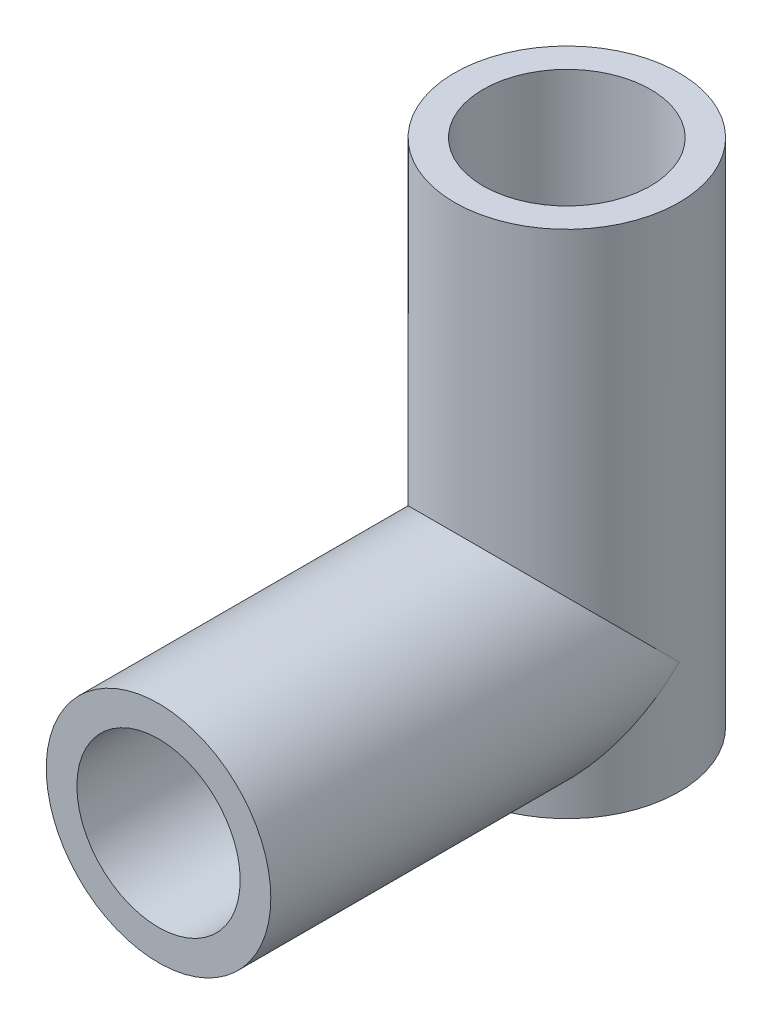
ISO-10303-21;
HEADER;
FILE_DESCRIPTION(('STEP AP214'),'2;1');
FILE_NAME('part.step','',(''),(''),'','','');
FILE_SCHEMA(('AUTOMOTIVE_DESIGN { 1 0 10303 214 1 1 1 1 }'));
ENDSEC;
DATA;
#1=APPLICATION_CONTEXT('core data for automotive mechanical design processes');
#2=APPLICATION_PROTOCOL_DEFINITION('international standard','automotive_design',2000,#1);
#3=PRODUCT_CONTEXT('',#1,'mechanical');
#4=PRODUCT('Part','Part','',(#3));
#5=PRODUCT_RELATED_PRODUCT_CATEGORY('part','',(#4));
#6=PRODUCT_DEFINITION_FORMATION('','',#4);
#7=PRODUCT_DEFINITION_CONTEXT('part definition',#1,'design');
#8=PRODUCT_DEFINITION('design','',#6,#7);
#9=PRODUCT_DEFINITION_SHAPE('','',#8);
#10=(LENGTH_UNIT() NAMED_UNIT(*) SI_UNIT(.MILLI.,.METRE.));
#11=(NAMED_UNIT(*) PLANE_ANGLE_UNIT() SI_UNIT($,.RADIAN.));
#12=(NAMED_UNIT(*) SI_UNIT($,.STERADIAN.) SOLID_ANGLE_UNIT());
#13=UNCERTAINTY_MEASURE_WITH_UNIT(LENGTH_MEASURE(1.E-05),#10,'distance_accuracy_value','');
#14=(GEOMETRIC_REPRESENTATION_CONTEXT(3) GLOBAL_UNCERTAINTY_ASSIGNED_CONTEXT((#13)) GLOBAL_UNIT_ASSIGNED_CONTEXT((#10,
#11,#12)) REPRESENTATION_CONTEXT('',''));
#15=CARTESIAN_POINT('',(0.,0.,0.));
#16=DIRECTION('',(0.,0.,1.));
#17=DIRECTION('',(1.,0.,0.));
#18=AXIS2_PLACEMENT_3D('',#15,#16,#17);
#19=CARTESIAN_POINT('',(0.,25.,0.));
#20=DIRECTION('',(0.,-1.,0.));
#21=DIRECTION('',(0.,0.,-1.));
#22=AXIS2_PLACEMENT_3D('',#19,#20,#21);
#23=CYLINDRICAL_SURFACE('',#22,5.5);
#24=CARTESIAN_POINT('',(0.,25.,0.));
#25=DIRECTION('',(0.,1.,0.));
#26=DIRECTION('',(0.,0.,1.));
#27=AXIS2_PLACEMENT_3D('',#24,#25,#26);
#28=CIRCLE('',#27,5.5);
#29=CARTESIAN_POINT('',(0.,25.,5.5));
#30=VERTEX_POINT('',#29);
#31=EDGE_CURVE('E11',#30,#30,#28,.T.);
#32=ORIENTED_EDGE('',*,*,#31,.F.);
#33=EDGE_LOOP('',(#32));
#34=FACE_BOUND('',#33,.T.);
#35=CARTESIAN_POINT('',(0.,5.5,0.));
#36=DIRECTION('',(0.,-0.707106781186547,-0.707106781186547));
#37=DIRECTION('',(0.,-0.707106781186547,0.707106781186547));
#38=AXIS2_PLACEMENT_3D('',#35,#36,#37);
#39=ELLIPSE('',#38,7.77817459305202,5.5);
#40=CARTESIAN_POINT('',(-5.5,5.5,0.));
#41=VERTEX_POINT('',#40);
#42=CARTESIAN_POINT('',(0.,0.,5.5));
#43=VERTEX_POINT('',#42);
#44=EDGE_CURVE('E67',#41,#43,#39,.F.);
#45=ORIENTED_EDGE('',*,*,#44,.F.);
#46=CARTESIAN_POINT('',(0.,5.5,0.));
#47=DIRECTION('',(0.,-0.707106781186547,0.707106781186547));
#48=DIRECTION('',(0.,-0.707106781186547,-0.707106781186547));
#49=AXIS2_PLACEMENT_3D('',#46,#47,#48);
#50=ELLIPSE('',#49,7.77817459305202,5.5);
#51=CARTESIAN_POINT('',(5.5,5.5,0.));
#52=VERTEX_POINT('',#51);
#53=EDGE_CURVE('E60',#52,#41,#50,.T.);
#54=ORIENTED_EDGE('',*,*,#53,.F.);
#55=EDGE_CURVE('E64',#43,#52,#39,.F.);
#56=ORIENTED_EDGE('',*,*,#55,.F.);
#57=CARTESIAN_POINT('',(0.,0.,0.));
#58=DIRECTION('',(0.,1.,0.));
#59=DIRECTION('',(0.,0.,1.));
#60=AXIS2_PLACEMENT_3D('',#57,#58,#59);
#61=CIRCLE('',#60,5.5);
#62=EDGE_CURVE('E52',#43,#43,#61,.T.);
#63=ORIENTED_EDGE('',*,*,#62,.T.);
#64=EDGE_LOOP('',(#45,#54,#56,#63));
#65=FACE_BOUND('',#64,.T.);
#66=ADVANCED_FACE('F39',(#34,#65),#23,.T.);
#67=CARTESIAN_POINT('',(0.,25.,0.));
#68=DIRECTION('',(0.,1.,0.));
#69=DIRECTION('',(0.,0.,1.));
#70=AXIS2_PLACEMENT_3D('',#67,#68,#69);
#71=PLANE('',#70);
#72=ORIENTED_EDGE('',*,*,#31,.T.);
#73=EDGE_LOOP('',(#72));
#74=FACE_BOUND('',#73,.T.);
#75=CARTESIAN_POINT('',(0.,25.,0.));
#76=DIRECTION('',(0.,1.,0.));
#77=DIRECTION('',(0.,0.,1.));
#78=AXIS2_PLACEMENT_3D('',#75,#76,#77);
#79=CIRCLE('',#78,4.1);
#80=CARTESIAN_POINT('',(0.,25.,4.1));
#81=VERTEX_POINT('',#80);
#82=EDGE_CURVE('E80',#81,#81,#79,.T.);
#83=ORIENTED_EDGE('',*,*,#82,.F.);
#84=EDGE_LOOP('',(#83));
#85=FACE_BOUND('',#84,.T.);
#86=ADVANCED_FACE('F95',(#74,#85),#71,.T.);
#87=CARTESIAN_POINT('',(0.,0.,0.));
#88=DIRECTION('',(0.,1.,0.));
#89=DIRECTION('',(0.,0.,1.));
#90=AXIS2_PLACEMENT_3D('',#87,#88,#89);
#91=PLANE('',#90);
#92=ORIENTED_EDGE('',*,*,#62,.F.);
#93=EDGE_LOOP('',(#92));
#94=FACE_BOUND('',#93,.T.);
#95=CARTESIAN_POINT('',(0.,0.,0.));
#96=DIRECTION('',(0.,1.,0.));
#97=DIRECTION('',(0.,0.,1.));
#98=AXIS2_PLACEMENT_3D('',#95,#96,#97);
#99=CIRCLE('',#98,4.1);
#100=CARTESIAN_POINT('',(0.,0.,4.1));
#101=VERTEX_POINT('',#100);
#102=EDGE_CURVE('E70',#101,#101,#99,.T.);
#103=ORIENTED_EDGE('',*,*,#102,.T.);
#104=EDGE_LOOP('',(#103));
#105=FACE_BOUND('',#104,.T.);
#106=ADVANCED_FACE('F86',(#94,#105),#91,.F.);
#107=CARTESIAN_POINT('',(0.,5.5,20.));
#108=DIRECTION('',(0.,0.,-1.));
#109=DIRECTION('',(-1.,0.,0.));
#110=AXIS2_PLACEMENT_3D('',#107,#108,#109);
#111=CYLINDRICAL_SURFACE('',#110,5.5);
#112=CARTESIAN_POINT('',(0.,5.5,20.));
#113=DIRECTION('',(0.,0.,1.));
#114=DIRECTION('',(1.,0.,0.));
#115=AXIS2_PLACEMENT_3D('',#112,#113,#114);
#116=CIRCLE('',#115,5.5);
#117=CARTESIAN_POINT('',(5.5,5.5,20.));
#118=VERTEX_POINT('',#117);
#119=EDGE_CURVE('E73',#118,#118,#116,.T.);
#120=ORIENTED_EDGE('',*,*,#119,.F.);
#121=EDGE_LOOP('',(#120));
#122=FACE_BOUND('',#121,.T.);
#123=ORIENTED_EDGE('',*,*,#53,.T.);
#124=ORIENTED_EDGE('',*,*,#44,.T.);
#125=ORIENTED_EDGE('',*,*,#55,.T.);
#126=EDGE_LOOP('',(#123,#124,#125));
#127=FACE_BOUND('',#126,.T.);
#128=ADVANCED_FACE('F72',(#122,#127),#111,.T.);
#129=CARTESIAN_POINT('',(0.,5.5,20.));
#130=DIRECTION('',(0.,0.,-1.));
#131=DIRECTION('',(-1.,0.,0.));
#132=AXIS2_PLACEMENT_3D('',#129,#130,#131);
#133=CYLINDRICAL_SURFACE('',#132,4.);
#134=CARTESIAN_POINT('',(0.,5.5,20.));
#135=DIRECTION('',(0.,0.,1.));
#136=DIRECTION('',(1.,0.,0.));
#137=AXIS2_PLACEMENT_3D('',#134,#135,#136);
#138=CIRCLE('',#137,4.);
#139=CARTESIAN_POINT('',(4.,5.5,20.));
#140=VERTEX_POINT('',#139);
#141=EDGE_CURVE('E76',#140,#140,#138,.T.);
#142=ORIENTED_EDGE('',*,*,#141,.T.);
#143=EDGE_LOOP('',(#142));
#144=FACE_BOUND('',#143,.T.);
#145=CARTESIAN_POINT('',(4.,5.5,0.900000000000002));
#146=CARTESIAN_POINT('',(3.99999512187246,5.4375343175563,0.900034209244205));
#147=CARTESIAN_POINT('',(3.99850932111862,5.3749574291253,0.906703122740835));
#148=CARTESIAN_POINT('',(3.99279521133903,5.25214514671615,0.931516555471092));
#149=CARTESIAN_POINT('',(3.98855178693911,5.19192460900738,0.949724308865309));
#150=CARTESIAN_POINT('',(3.97764668858797,5.07344362595285,0.994416096802002));
#151=CARTESIAN_POINT('',(3.97093223785516,5.01525885157617,1.02107885198149));
#152=CARTESIAN_POINT('',(3.95543056181385,4.90179481416448,1.07958123620313));
#153=CARTESIAN_POINT('',(3.94663940581158,4.84652130709797,1.11143064635887));
#154=CARTESIAN_POINT('',(3.9173535817564,4.68352529581143,1.21210036601213));
#155=CARTESIAN_POINT('',(3.89401837149312,4.57933245965473,1.28571683289103));
#156=CARTESIAN_POINT('',(3.83078988199655,4.34010227874842,1.46532414923954));
#157=CARTESIAN_POINT('',(3.78796015666689,4.20750064281365,1.5734120945195));
#158=CARTESIAN_POINT('',(3.6896017389949,3.94889813655629,1.79201036517367));
#159=CARTESIAN_POINT('',(3.63405601528662,3.8229064000315,1.90252375798241));
#160=CARTESIAN_POINT('',(3.51016817888633,3.57708514662728,2.12240614635684));
#161=CARTESIAN_POINT('',(3.44186437906804,3.45723851455936,2.23177755915393));
#162=CARTESIAN_POINT('',(3.29192644595773,3.22349521058783,2.44754516081317));
#163=CARTESIAN_POINT('',(3.21030284232772,3.10959393184506,2.55394362268108));
#164=CARTESIAN_POINT('',(3.05681264091029,2.91801181690004,2.73421277557739));
#165=CARTESIAN_POINT('',(2.98816456971572,2.83878350964819,2.80917990712021));
#166=CARTESIAN_POINT('',(2.84319812422652,2.68442827700435,2.9558187168706));
#167=CARTESIAN_POINT('',(2.76687925325546,2.60930161767649,3.0274901812486));
#168=CARTESIAN_POINT('',(2.52628469182291,2.39119407007603,3.23618232269641));
#169=CARTESIAN_POINT('',(2.35008160998065,2.25511643443879,3.36723017679752));
#170=CARTESIAN_POINT('',(2.01104122004143,2.03790711348327,3.57708168591731));
#171=CARTESIAN_POINT('',(1.85482063793954,1.95138152003905,3.66092197742092));
#172=CARTESIAN_POINT('',(1.60750364218169,1.83609158845121,3.77281584205972));
#173=CARTESIAN_POINT('',(1.52287060194032,1.80006865081248,3.80781184023007));
#174=CARTESIAN_POINT('',(1.34960737519643,1.73341473972521,3.87260939036772));
#175=CARTESIAN_POINT('',(1.26097902346161,1.70278132230456,3.90241329671926));
#176=CARTESIAN_POINT('',(1.07922751454991,1.64715760961542,3.95655828617508));
#177=CARTESIAN_POINT('',(0.986066832330187,1.6222301855762,3.98083849022538));
#178=CARTESIAN_POINT('',(0.796850732694764,1.57897471757708,4.02298590581365));
#179=CARTESIAN_POINT('',(0.70079695021387,1.56064301938268,4.04085666836138));
#180=CARTESIAN_POINT('',(0.506655809385976,1.53100330624393,4.06975723189268));
#181=CARTESIAN_POINT('',(0.408569826969707,1.51969068980614,4.08079151465461));
#182=CARTESIAN_POINT('',(0.211298230692265,1.50436023863454,4.09574586935578));
#183=CARTESIAN_POINT('',(0.1121128074777,1.50034115848709,4.09966715588035));
#184=CARTESIAN_POINT('',(-0.0711350218905603,1.49974945298669,4.10024444168275));
#185=CARTESIAN_POINT('',(-0.155193164967518,1.50213313504172,4.09791874144877));
#186=CARTESIAN_POINT('',(-0.322703297750207,1.51215368580207,4.08814349749723));
#187=CARTESIAN_POINT('',(-0.406155096118995,1.51979214564585,4.08069240181805));
#188=CARTESIAN_POINT('',(-0.654591704117796,1.55041154661343,4.05083035775105));
#189=CARTESIAN_POINT('',(-0.81783598976107,1.58109633855123,4.02091080560532));
#190=CARTESIAN_POINT('',(-1.13198105356593,1.66015246585267,3.9439005577162));
#191=CARTESIAN_POINT('',(-1.28305965171107,1.70816977843538,3.8971536166075));
#192=CARTESIAN_POINT('',(-1.57390890527154,1.81936538871525,3.78905030180337));
#193=CARTESIAN_POINT('',(-1.71367606362352,1.88254835128817,3.72768943298428));
#194=CARTESIAN_POINT('',(-2.04320117991982,2.05410594507399,3.5613972508724));
#195=CARTESIAN_POINT('',(-2.22566201401954,2.16977777061851,3.44952830837587));
#196=CARTESIAN_POINT('',(-2.5625301833743,2.42138329161429,3.20728898019238));
#197=CARTESIAN_POINT('',(-2.71685459328156,2.55737479771615,3.07686585924215));
#198=CARTESIAN_POINT('',(-2.95387780226061,2.79933158534407,2.84652562024143));
#199=CARTESIAN_POINT('',(-3.04387802981076,2.90137569846404,2.74983422816076));
#200=CARTESIAN_POINT('',(-3.2114145177881,3.11150938849529,2.55217625303303));
#201=CARTESIAN_POINT('',(-3.28894444939857,3.21960199781385,2.45120753182652));
#202=CARTESIAN_POINT('',(-3.43183106619089,3.44090765229118,2.24678954175134));
#203=CARTESIAN_POINT('',(-3.49720655160397,3.55411244713631,2.14334438793669));
#204=CARTESIAN_POINT('',(-3.61632626413185,3.78560739135265,1.93558327980142));
#205=CARTESIAN_POINT('',(-3.67007672919136,3.90389477237435,1.83126782384935));
#206=CARTESIAN_POINT('',(-3.75515270751627,4.11837511572771,1.64819397444343));
#207=CARTESIAN_POINT('',(-3.7887907951889,4.21336795775816,1.56909271379544));
#208=CARTESIAN_POINT('',(-3.84943991313728,4.40809640987526,1.41376355328168));
#209=CARTESIAN_POINT('',(-3.87644007650815,4.5078394821164,1.33754053573802));
#210=CARTESIAN_POINT('',(-3.91917554082953,4.69529030389344,1.20579759174255));
#211=CARTESIAN_POINT('',(-3.93606809687947,4.78186033237081,1.14904159972965));
#212=CARTESIAN_POINT('',(-3.96468491281336,4.96191431659416,1.04597603683258));
#213=CARTESIAN_POINT('',(-3.97643156004271,5.05536621499924,0.999621652247419));
#214=CARTESIAN_POINT('',(-3.98948369643447,5.2054830277291,0.945738611169692));
#215=CARTESIAN_POINT('',(-3.99310329246064,5.25893720090264,0.930188557117248));
#216=CARTESIAN_POINT('',(-3.99817894262795,5.36768850636157,0.908128121673607));
#217=CARTESIAN_POINT('',(-3.99964304707969,5.42297798852728,0.901584110598907));
#218=CARTESIAN_POINT('',(-4.00024201593255,5.53413819089711,0.898926654632815));
#219=CARTESIAN_POINT('',(-3.99936426197302,5.5900104375604,0.902869715641036));
#220=CARTESIAN_POINT('',(-3.99536974926533,5.70021052476466,0.920376850660911));
#221=CARTESIAN_POINT('',(-3.9922460487558,5.75453303285595,0.933970751799343));
#222=CARTESIAN_POINT('',(-3.98160523124016,5.89256842245622,0.978562865336122));
#223=CARTESIAN_POINT('',(-3.97257531808295,5.97428755875869,1.01511199057132));
#224=CARTESIAN_POINT('',(-3.95053195649987,6.13222565974304,1.09779390117788));
#225=CARTESIAN_POINT('',(-3.93749852088673,6.20841460093202,1.14397439013037));
#226=CARTESIAN_POINT('',(-3.91009615227607,6.34573842713599,1.23411514023584));
#227=CARTESIAN_POINT('',(-3.8962123723838,6.40742955198429,1.27738801258292));
#228=CARTESIAN_POINT('',(-3.86599000357159,6.52860099369416,1.36613506839897));
#229=CARTESIAN_POINT('',(-3.84965038468982,6.58808036984567,1.41161017001801));
#230=CARTESIAN_POINT('',(-3.7969769624213,6.76412972750892,1.55006197175322));
#231=CARTESIAN_POINT('',(-3.75702536226416,6.87813177599649,1.64493931625982));
#232=CARTESIAN_POINT('',(-3.66740066013,7.10144841258777,1.83613789797702));
#233=CARTESIAN_POINT('',(-3.6177042957521,7.21075100570409,1.93246207070207));
#234=CARTESIAN_POINT('',(-3.50847137763241,7.42485352166673,2.12433719415601));
#235=CARTESIAN_POINT('',(-3.44894305504434,7.52965711930304,2.21988872212771));
#236=CARTESIAN_POINT('',(-3.31529162267916,7.74178230796857,2.41532313724015));
#237=CARTESIAN_POINT('',(-3.24045234866178,7.84879235151344,2.51506008507178));
#238=CARTESIAN_POINT('',(-3.07873102516948,8.05711444789653,2.71063810215492));
#239=CARTESIAN_POINT('',(-2.99184357236794,8.15842391534069,2.80647739831973));
#240=CARTESIAN_POINT('',(-2.71301213243328,8.45161179701525,3.08517289429797));
#241=CARTESIAN_POINT('',(-2.50216356076423,8.63395373220813,3.26033120919621));
#242=CARTESIAN_POINT('',(-2.12244258025792,8.89490069799994,3.5120830131376));
#243=CARTESIAN_POINT('',(-1.96984132981645,8.98604674302971,3.60029518540771));
#244=CARTESIAN_POINT('',(-1.72742765898846,9.10890773614932,3.71942363871274));
#245=CARTESIAN_POINT('',(-1.64434041976784,9.14756256380176,3.75694539168326));
#246=CARTESIAN_POINT('',(-1.47394154032751,9.21968370758971,3.82700592822387));
#247=CARTESIAN_POINT('',(-1.38663167994337,9.25315218519104,3.85954678756409));
#248=CARTESIAN_POINT('',(-1.20721543565916,9.31467168623572,3.91939646577793));
#249=CARTESIAN_POINT('',(-1.11506760259172,9.34266065418415,3.94664532788402));
#250=CARTESIAN_POINT('',(-0.927502386623182,9.39218956063005,3.99488524534777));
#251=CARTESIAN_POINT('',(-0.832086866698266,9.41373310776363,4.0158798023122));
#252=CARTESIAN_POINT('',(-0.638791914668875,9.4498866450519,4.05112184742753));
#253=CARTESIAN_POINT('',(-0.540914307335132,9.46450161962384,4.06537418591667));
#254=CARTESIAN_POINT('',(-0.343582587415631,9.48645211216291,4.08678290561652));
#255=CARTESIAN_POINT('',(-0.244128752704877,9.4937888990218,4.0939405237328));
#256=CARTESIAN_POINT('',(-0.0591330553226261,9.50047396522945,4.10046236430658));
#257=CARTESIAN_POINT('',(0.0263407796324998,9.50082405679646,4.10080393012048));
#258=CARTESIAN_POINT('',(0.197018980386742,9.49605723642129,4.09615345770384));
#259=CARTESIAN_POINT('',(0.282223253970105,9.49093862177185,4.09115975831351));
#260=CARTESIAN_POINT('',(0.451630262338278,9.47533146037097,4.0759363609706));
#261=CARTESIAN_POINT('',(0.535833399117204,9.46484514896929,4.06570884261553));
#262=CARTESIAN_POINT('',(0.702672302117009,9.43870491660032,4.04022131000474));
#263=CARTESIAN_POINT('',(0.785307432278798,9.4230489440343,4.02495929779436));
#264=CARTESIAN_POINT('',(1.02295562168656,9.37027760600306,3.97353576764096));
#265=CARTESIAN_POINT('',(1.17522066697733,9.32661533819333,3.93101023879185));
#266=CARTESIAN_POINT('',(1.46900223020301,9.22375454172561,3.83095377316376));
#267=CARTESIAN_POINT('',(1.61051561974127,9.16455151334484,3.77341849044126));
#268=CARTESIAN_POINT('',(1.94055089727538,9.00442457085953,3.61807436535428));
#269=CARTESIAN_POINT('',(2.12261209346515,8.89657179629353,3.51365065903059));
#270=CARTESIAN_POINT('',(2.46030186139983,8.66063040335656,3.28612144080324));
#271=CARTESIAN_POINT('',(2.61585793413593,8.53248807518956,3.16296637901344));
#272=CARTESIAN_POINT('',(2.85616009367819,8.30367635380485,2.94445956067986));
#273=CARTESIAN_POINT('',(2.94784156168751,8.20693898663675,2.85244932773757));
#274=CARTESIAN_POINT('',(3.11930679486545,8.00743641483868,2.66386382688851));
#275=CARTESIAN_POINT('',(3.19908489921167,7.90466837439534,2.56728641556139));
#276=CARTESIAN_POINT('',(3.34703593280937,7.69405993473674,2.37116496805844));
#277=CARTESIAN_POINT('',(3.41522100478045,7.58622499571928,2.27162416585372));
#278=CARTESIAN_POINT('',(3.54047742275772,7.36576935892737,2.07098557992803));
#279=CARTESIAN_POINT('',(3.59755366590902,7.25315079673011,1.96988850357157));
#280=CARTESIAN_POINT('',(3.69613402244496,7.03352787667365,1.77740783748119));
#281=CARTESIAN_POINT('',(3.73859235066176,6.92697438271642,1.68599465793896));
#282=CARTESIAN_POINT('',(3.81482228099257,6.7085383760096,1.50554529406755));
#283=CARTESIAN_POINT('',(3.84858434480022,6.59665017000443,1.41651181494395));
#284=CARTESIAN_POINT('',(3.90049142293011,6.3914532602663,1.26532222851219));
#285=CARTESIAN_POINT('',(3.92044192428526,6.29970940739843,1.20165988438746));
#286=CARTESIAN_POINT('',(3.9545525433956,6.10899998037958,1.08404849188005));
#287=CARTESIAN_POINT('',(3.96873194959482,6.01005978733335,1.03006743035495));
#288=CARTESIAN_POINT('',(3.98487160422127,5.85176988605073,0.965069534331619));
#289=CARTESIAN_POINT('',(3.98943084136572,5.79618348310664,0.945862467479106));
#290=CARTESIAN_POINT('',(3.99623051492282,5.68257852823507,0.916719773313306));
#291=CARTESIAN_POINT('',(3.99848211155788,5.6245731075699,0.906739546305785));
#292=CARTESIAN_POINT('',(3.99981818260463,5.54417422698702,0.900805823234736));
#293=CARTESIAN_POINT('',(4.00000172539041,5.52209406960657,0.899987900213479));
#294=CARTESIAN_POINT('',(4.,5.5,0.900000000000002));
#295=B_SPLINE_CURVE_WITH_KNOTS('',3,(#145,#146,#147,#148,#149,#150,#151,#152,#153,#154,#155,
#156,#157,#158,#159,#160,#161,#162,#163,#164,#165,#166,#167,#168,#169,#170,#171,#172,#173,#174,
#175,#176,#177,#178,#179,#180,#181,#182,#183,#184,#185,#186,#187,#188,#189,#190,#191,#192,#193,
#194,#195,#196,#197,#198,#199,#200,#201,#202,#203,#204,#205,#206,#207,#208,#209,#210,#211,#212,
#213,#214,#215,#216,#217,#218,#219,#220,#221,#222,#223,#224,#225,#226,#227,#228,#229,#230,#231,
#232,#233,#234,#235,#236,#237,#238,#239,#240,#241,#242,#243,#244,#245,#246,#247,#248,#249,#250,
#251,#252,#253,#254,#255,#256,#257,#258,#259,#260,#261,#262,#263,#264,#265,#266,#267,#268,#269,
#270,#271,#272,#273,#274,#275,#276,#277,#278,#279,#280,#281,#282,#283,#284,#285,#286,#287,#288,
#289,#290,#291,#292,#293,#294),.UNSPECIFIED.,.T.,.F.,(4,2,2,2,2,2,2,2,2,2,2,2,2,2,2,2,2,2,2,2,2,
2,2,2,2,2,2,2,2,2,2,2,2,2,2,2,2,2,2,2,2,2,2,2,2,2,2,2,2,2,2,2,2,2,2,2,2,2,2,2,2,2,2,2,2,2,2,2,2,
2,2,2,2,2,4),(0.,0.187303893135897,0.375643215432972,0.568263689145495,0.761251709406206,
1.14954367944191,1.67793957252941,2.20704736471012,2.73459105810343,3.26171971655478,
3.64803053579099,4.03436638439025,4.80530002807479,5.394766310613,5.68969166362237,
5.98448293092338,6.28238081097835,6.58011339139831,6.87765058072385,7.17513695906566,
7.4271812377656,7.67930186868888,8.18301559608141,8.67697448091245,9.17108550010039,
9.89693144957931,10.624883242553,11.1250333612144,11.6254365162408,12.1250590992317,
12.6244129176732,13.0085388559728,13.3932895184532,13.7076325492041,14.0205941061579,
14.1873441824901,14.3534698881858,14.5204925147942,14.688033605622,14.9564346926302,
15.2261981439001,15.4559320336486,15.6857625424422,16.1460872770465,16.6075245645413,
17.0685774844383,17.5609095804569,18.0534631943699,19.0332252036965,19.6263424297059,
19.9231040105756,20.219741578374,20.5195655909529,20.8192214237844,21.1186613557542,
21.4180490736722,21.6741412407638,21.9303131665926,22.1863784976252,22.4425455714874,
22.9324200735724,23.4224365722801,24.1264543099143,24.8323678542659,25.3176375530397,
25.803137298506,26.2881253488126,26.7728991134164,27.2126222283226,27.6528256095934,
27.9928721881325,28.3317727238992,28.5081791023939,28.6837282592637,28.7499775195077),.UNSPECIFIED.);
#296=CARTESIAN_POINT('',(4.,5.5,0.900000000000002));
#297=VERTEX_POINT('',#296);
#298=EDGE_CURVE('E42',#297,#297,#295,.T.);
#299=ORIENTED_EDGE('',*,*,#298,.T.);
#300=EDGE_LOOP('',(#299));
#301=FACE_BOUND('',#300,.T.);
#302=ADVANCED_FACE('F109',(#144,#301),#133,.F.);
#303=CARTESIAN_POINT('',(0.,5.5,20.));
#304=DIRECTION('',(0.,0.,1.));
#305=DIRECTION('',(1.,0.,0.));
#306=AXIS2_PLACEMENT_3D('',#303,#304,#305);
#307=PLANE('',#306);
#308=ORIENTED_EDGE('',*,*,#119,.T.);
#309=EDGE_LOOP('',(#308));
#310=FACE_BOUND('',#309,.T.);
#311=ORIENTED_EDGE('',*,*,#141,.F.);
#312=EDGE_LOOP('',(#311));
#313=FACE_BOUND('',#312,.T.);
#314=ADVANCED_FACE('F91',(#310,#313),#307,.T.);
#315=CARTESIAN_POINT('',(0.,25.,0.));
#316=DIRECTION('',(0.,-1.,0.));
#317=DIRECTION('',(0.,0.,-1.));
#318=AXIS2_PLACEMENT_3D('',#315,#316,#317);
#319=CYLINDRICAL_SURFACE('',#318,4.1);
#320=ORIENTED_EDGE('',*,*,#298,.F.);
#321=EDGE_LOOP('',(#320));
#322=FACE_BOUND('',#321,.T.);
#323=ORIENTED_EDGE('',*,*,#102,.F.);
#324=EDGE_LOOP('',(#323));
#325=FACE_BOUND('',#324,.T.);
#326=ORIENTED_EDGE('',*,*,#82,.T.);
#327=EDGE_LOOP('',(#326));
#328=FACE_BOUND('',#327,.T.);
#329=ADVANCED_FACE('F88',(#322,#325,#328),#319,.F.);
#330=CLOSED_SHELL('',(#66,#86,#106,#128,#302,#314,#329));
#331=MANIFOLD_SOLID_BREP('B2',#330);
#332=ADVANCED_BREP_SHAPE_REPRESENTATION('',(#18,#331),#14);
#333=SHAPE_DEFINITION_REPRESENTATION(#9,#332);
ENDSEC;
END-ISO-10303-21;
